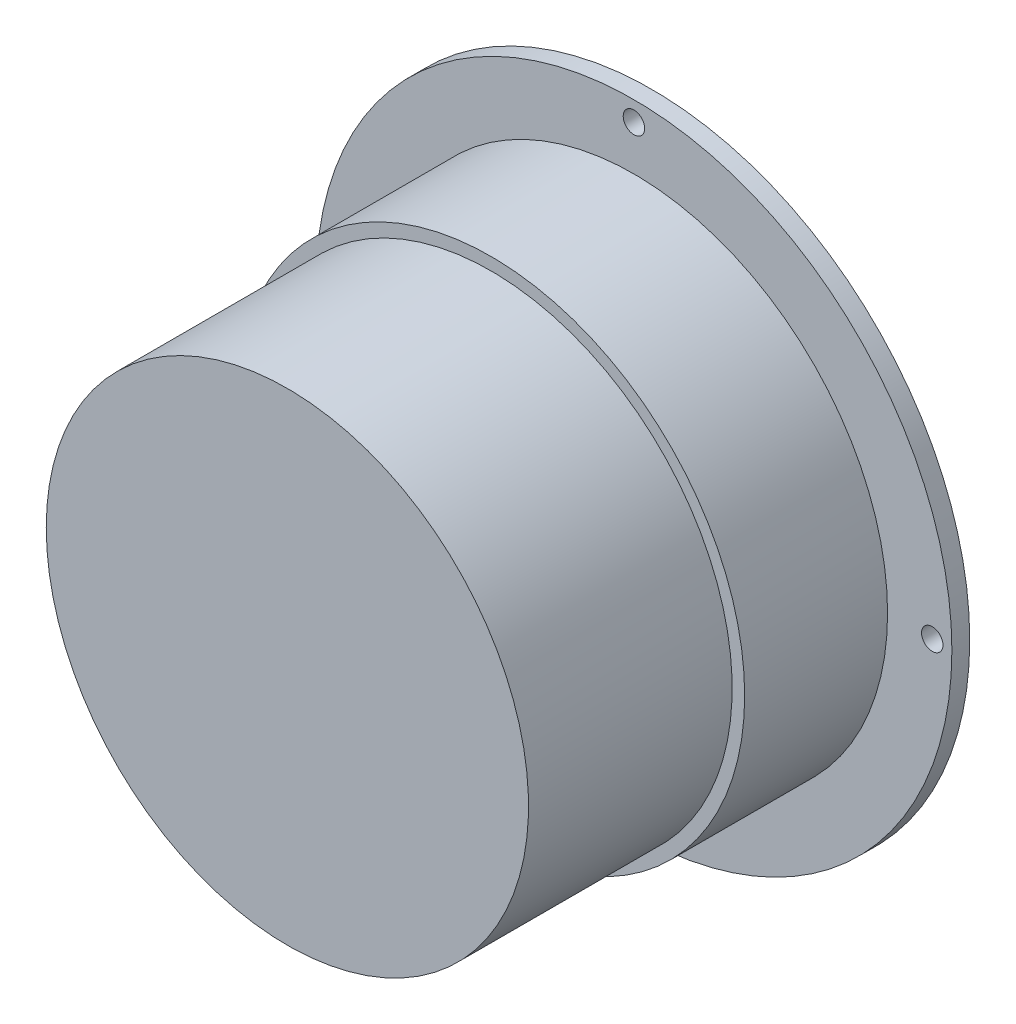
ISO-10303-21;
HEADER;
FILE_DESCRIPTION(('STEP AP214'),'2;1');
FILE_NAME('part.step','',(''),(''),'','','');
FILE_SCHEMA(('AUTOMOTIVE_DESIGN { 1 0 10303 214 1 1 1 1 }'));
ENDSEC;
DATA;
#1=APPLICATION_CONTEXT('core data for automotive mechanical design processes');
#2=APPLICATION_PROTOCOL_DEFINITION('international standard','automotive_design',2000,#1);
#3=PRODUCT_CONTEXT('',#1,'mechanical');
#4=PRODUCT('Part','Part','',(#3));
#5=PRODUCT_RELATED_PRODUCT_CATEGORY('part','',(#4));
#6=PRODUCT_DEFINITION_FORMATION('','',#4);
#7=PRODUCT_DEFINITION_CONTEXT('part definition',#1,'design');
#8=PRODUCT_DEFINITION('design','',#6,#7);
#9=PRODUCT_DEFINITION_SHAPE('','',#8);
#10=(LENGTH_UNIT() NAMED_UNIT(*) SI_UNIT(.MILLI.,.METRE.));
#11=(NAMED_UNIT(*) PLANE_ANGLE_UNIT() SI_UNIT($,.RADIAN.));
#12=(NAMED_UNIT(*) SI_UNIT($,.STERADIAN.) SOLID_ANGLE_UNIT());
#13=UNCERTAINTY_MEASURE_WITH_UNIT(LENGTH_MEASURE(1.E-05),#10,'distance_accuracy_value','');
#14=(GEOMETRIC_REPRESENTATION_CONTEXT(3) GLOBAL_UNCERTAINTY_ASSIGNED_CONTEXT((#13)) GLOBAL_UNIT_ASSIGNED_CONTEXT((#10,
#11,#12)) REPRESENTATION_CONTEXT('',''));
#15=CARTESIAN_POINT('',(0.,0.,0.));
#16=DIRECTION('',(0.,0.,1.));
#17=DIRECTION('',(1.,0.,0.));
#18=AXIS2_PLACEMENT_3D('',#15,#16,#17);
#19=CARTESIAN_POINT('',(0.,0.,2.5));
#20=DIRECTION('',(0.,0.,-1.));
#21=DIRECTION('',(-1.,0.,0.));
#22=AXIS2_PLACEMENT_3D('',#19,#20,#21);
#23=CYLINDRICAL_SURFACE('',#22,44.5);
#24=CARTESIAN_POINT('',(0.,0.,2.5));
#25=DIRECTION('',(0.,0.,1.));
#26=DIRECTION('',(1.,0.,0.));
#27=AXIS2_PLACEMENT_3D('',#24,#25,#26);
#28=CIRCLE('',#27,44.5);
#29=CARTESIAN_POINT('',(44.5,0.,2.5));
#30=VERTEX_POINT('',#29);
#31=EDGE_CURVE('E12',#30,#30,#28,.T.);
#32=ORIENTED_EDGE('',*,*,#31,.F.);
#33=EDGE_LOOP('',(#32));
#34=FACE_BOUND('',#33,.T.);
#35=CARTESIAN_POINT('',(0.,0.,0.));
#36=DIRECTION('',(0.,0.,1.));
#37=DIRECTION('',(1.,0.,0.));
#38=AXIS2_PLACEMENT_3D('',#35,#36,#37);
#39=CIRCLE('',#38,44.5);
#40=CARTESIAN_POINT('',(44.5,0.,0.));
#41=VERTEX_POINT('',#40);
#42=EDGE_CURVE('E45',#41,#41,#39,.T.);
#43=ORIENTED_EDGE('',*,*,#42,.T.);
#44=EDGE_LOOP('',(#43));
#45=FACE_BOUND('',#44,.T.);
#46=ADVANCED_FACE('F42',(#34,#45),#23,.T.);
#47=CARTESIAN_POINT('',(0.,0.,2.5));
#48=DIRECTION('',(0.,0.,1.));
#49=DIRECTION('',(1.,0.,0.));
#50=AXIS2_PLACEMENT_3D('',#47,#48,#49);
#51=PLANE('',#50);
#52=CARTESIAN_POINT('',(0.,0.,2.5));
#53=DIRECTION('',(0.,0.,1.));
#54=DIRECTION('',(1.,0.,0.));
#55=AXIS2_PLACEMENT_3D('',#52,#53,#54);
#56=CIRCLE('',#55,35.5);
#57=CARTESIAN_POINT('',(35.5,0.,2.5));
#58=VERTEX_POINT('',#57);
#59=EDGE_CURVE('E78',#58,#58,#56,.T.);
#60=ORIENTED_EDGE('',*,*,#59,.F.);
#61=EDGE_LOOP('',(#60));
#62=FACE_BOUND('',#61,.T.);
#63=CARTESIAN_POINT('',(41.7500000000012,1.18149346833293E-12,2.5));
#64=DIRECTION('',(0.,0.,1.));
#65=DIRECTION('',(1.,0.,0.));
#66=AXIS2_PLACEMENT_3D('',#63,#64,#65);
#67=CIRCLE('',#66,1.50000000000092);
#68=CARTESIAN_POINT('',(43.2500000000021,1.18149346833293E-12,2.5));
#69=VERTEX_POINT('',#68);
#70=EDGE_CURVE('E73',#69,#69,#67,.T.);
#71=ORIENTED_EDGE('',*,*,#70,.F.);
#72=EDGE_LOOP('',(#71));
#73=FACE_BOUND('',#72,.T.);
#74=CARTESIAN_POINT('',(2.36298693666585E-12,-41.75,2.5));
#75=DIRECTION('',(0.,0.,1.));
#76=DIRECTION('',(1.,0.,0.));
#77=AXIS2_PLACEMENT_3D('',#74,#75,#76);
#78=CIRCLE('',#77,1.50000000000254);
#79=CARTESIAN_POINT('',(1.5000000000049,-41.75,2.5));
#80=VERTEX_POINT('',#79);
#81=EDGE_CURVE('E67',#80,#80,#78,.T.);
#82=ORIENTED_EDGE('',*,*,#81,.F.);
#83=EDGE_LOOP('',(#82));
#84=FACE_BOUND('',#83,.T.);
#85=CARTESIAN_POINT('',(-41.7499999999988,-1.18660636871937E-12,2.5));
#86=DIRECTION('',(0.,0.,1.));
#87=DIRECTION('',(1.,0.,0.));
#88=AXIS2_PLACEMENT_3D('',#85,#86,#87);
#89=CIRCLE('',#88,1.5000000000019);
#90=CARTESIAN_POINT('',(-40.2499999999969,-1.18660636871937E-12,2.5));
#91=VERTEX_POINT('',#90);
#92=EDGE_CURVE('E60',#91,#91,#89,.T.);
#93=ORIENTED_EDGE('',*,*,#92,.F.);
#94=EDGE_LOOP('',(#93));
#95=FACE_BOUND('',#94,.T.);
#96=CARTESIAN_POINT('',(0.,41.75,2.5));
#97=DIRECTION('',(0.,0.,1.));
#98=DIRECTION('',(1.,0.,0.));
#99=AXIS2_PLACEMENT_3D('',#96,#97,#98);
#100=CIRCLE('',#99,1.5);
#101=CARTESIAN_POINT('',(1.5,41.75,2.5));
#102=VERTEX_POINT('',#101);
#103=EDGE_CURVE('E54',#102,#102,#100,.T.);
#104=ORIENTED_EDGE('',*,*,#103,.F.);
#105=EDGE_LOOP('',(#104));
#106=FACE_BOUND('',#105,.T.);
#107=ORIENTED_EDGE('',*,*,#31,.T.);
#108=EDGE_LOOP('',(#107));
#109=FACE_BOUND('',#108,.T.);
#110=ADVANCED_FACE('F111',(#62,#73,#84,#95,#106,#109),#51,.T.);
#111=CARTESIAN_POINT('',(0.,0.,0.));
#112=DIRECTION('',(0.,0.,1.));
#113=DIRECTION('',(1.,0.,0.));
#114=AXIS2_PLACEMENT_3D('',#111,#112,#113);
#115=PLANE('',#114);
#116=CARTESIAN_POINT('',(41.7500000000012,1.18149346833293E-12,0.));
#117=DIRECTION('',(0.,0.,1.));
#118=DIRECTION('',(1.,0.,0.));
#119=AXIS2_PLACEMENT_3D('',#116,#117,#118);
#120=CIRCLE('',#119,1.50000000000092);
#121=CARTESIAN_POINT('',(43.2500000000021,1.18149346833293E-12,0.));
#122=VERTEX_POINT('',#121);
#123=EDGE_CURVE('E57',#122,#122,#120,.T.);
#124=ORIENTED_EDGE('',*,*,#123,.T.);
#125=EDGE_LOOP('',(#124));
#126=FACE_BOUND('',#125,.T.);
#127=CARTESIAN_POINT('',(2.36298693666585E-12,-41.75,0.));
#128=DIRECTION('',(0.,0.,1.));
#129=DIRECTION('',(1.,0.,0.));
#130=AXIS2_PLACEMENT_3D('',#127,#128,#129);
#131=CIRCLE('',#130,1.50000000000254);
#132=CARTESIAN_POINT('',(1.5000000000049,-41.75,0.));
#133=VERTEX_POINT('',#132);
#134=EDGE_CURVE('E70',#133,#133,#131,.T.);
#135=ORIENTED_EDGE('',*,*,#134,.T.);
#136=EDGE_LOOP('',(#135));
#137=FACE_BOUND('',#136,.T.);
#138=CARTESIAN_POINT('',(-41.7499999999988,-1.18660636871937E-12,0.));
#139=DIRECTION('',(0.,0.,1.));
#140=DIRECTION('',(1.,0.,0.));
#141=AXIS2_PLACEMENT_3D('',#138,#139,#140);
#142=CIRCLE('',#141,1.5000000000019);
#143=CARTESIAN_POINT('',(-40.2499999999969,-1.18660636871937E-12,0.));
#144=VERTEX_POINT('',#143);
#145=EDGE_CURVE('E63',#144,#144,#142,.T.);
#146=ORIENTED_EDGE('',*,*,#145,.T.);
#147=EDGE_LOOP('',(#146));
#148=FACE_BOUND('',#147,.T.);
#149=CARTESIAN_POINT('',(0.,41.75,0.));
#150=DIRECTION('',(0.,0.,1.));
#151=DIRECTION('',(1.,0.,0.));
#152=AXIS2_PLACEMENT_3D('',#149,#150,#151);
#153=CIRCLE('',#152,1.5);
#154=CARTESIAN_POINT('',(1.5,41.75,0.));
#155=VERTEX_POINT('',#154);
#156=EDGE_CURVE('E52',#155,#155,#153,.T.);
#157=ORIENTED_EDGE('',*,*,#156,.T.);
#158=EDGE_LOOP('',(#157));
#159=FACE_BOUND('',#158,.T.);
#160=ORIENTED_EDGE('',*,*,#42,.F.);
#161=EDGE_LOOP('',(#160));
#162=FACE_BOUND('',#161,.T.);
#163=ADVANCED_FACE('F114',(#126,#137,#148,#159,#162),#115,.F.);
#164=CARTESIAN_POINT('',(0.,41.75,0.));
#165=DIRECTION('',(0.,0.,1.));
#166=DIRECTION('',(1.,0.,0.));
#167=AXIS2_PLACEMENT_3D('',#164,#165,#166);
#168=CYLINDRICAL_SURFACE('',#167,1.5);
#169=ORIENTED_EDGE('',*,*,#156,.F.);
#170=EDGE_LOOP('',(#169));
#171=FACE_BOUND('',#170,.T.);
#172=ORIENTED_EDGE('',*,*,#103,.T.);
#173=EDGE_LOOP('',(#172));
#174=FACE_BOUND('',#173,.T.);
#175=ADVANCED_FACE('F124',(#171,#174),#168,.F.);
#176=CARTESIAN_POINT('',(-41.7499999999988,-1.18660636871937E-12,0.));
#177=DIRECTION('',(0.,0.,1.));
#178=DIRECTION('',(1.,0.,0.));
#179=AXIS2_PLACEMENT_3D('',#176,#177,#178);
#180=CYLINDRICAL_SURFACE('',#179,1.5000000000019);
#181=ORIENTED_EDGE('',*,*,#145,.F.);
#182=EDGE_LOOP('',(#181));
#183=FACE_BOUND('',#182,.T.);
#184=ORIENTED_EDGE('',*,*,#92,.T.);
#185=EDGE_LOOP('',(#184));
#186=FACE_BOUND('',#185,.T.);
#187=ADVANCED_FACE('F126',(#183,#186),#180,.F.);
#188=CARTESIAN_POINT('',(2.36298693666585E-12,-41.75,0.));
#189=DIRECTION('',(0.,0.,1.));
#190=DIRECTION('',(1.,0.,0.));
#191=AXIS2_PLACEMENT_3D('',#188,#189,#190);
#192=CYLINDRICAL_SURFACE('',#191,1.50000000000254);
#193=ORIENTED_EDGE('',*,*,#134,.F.);
#194=EDGE_LOOP('',(#193));
#195=FACE_BOUND('',#194,.T.);
#196=ORIENTED_EDGE('',*,*,#81,.T.);
#197=EDGE_LOOP('',(#196));
#198=FACE_BOUND('',#197,.T.);
#199=ADVANCED_FACE('F133',(#195,#198),#192,.F.);
#200=CARTESIAN_POINT('',(41.7500000000012,1.18149346833293E-12,0.));
#201=DIRECTION('',(0.,0.,1.));
#202=DIRECTION('',(1.,0.,0.));
#203=AXIS2_PLACEMENT_3D('',#200,#201,#202);
#204=CYLINDRICAL_SURFACE('',#203,1.50000000000092);
#205=ORIENTED_EDGE('',*,*,#123,.F.);
#206=EDGE_LOOP('',(#205));
#207=FACE_BOUND('',#206,.T.);
#208=ORIENTED_EDGE('',*,*,#70,.T.);
#209=EDGE_LOOP('',(#208));
#210=FACE_BOUND('',#209,.T.);
#211=ADVANCED_FACE('F107',(#207,#210),#204,.F.);
#212=CARTESIAN_POINT('',(0.,0.,22.5));
#213=DIRECTION('',(0.,0.,-1.));
#214=DIRECTION('',(-1.,0.,0.));
#215=AXIS2_PLACEMENT_3D('',#212,#213,#214);
#216=CYLINDRICAL_SURFACE('',#215,35.5);
#217=CARTESIAN_POINT('',(0.,0.,22.5));
#218=DIRECTION('',(0.,0.,1.));
#219=DIRECTION('',(1.,0.,0.));
#220=AXIS2_PLACEMENT_3D('',#217,#218,#219);
#221=CIRCLE('',#220,35.5);
#222=CARTESIAN_POINT('',(35.5,0.,22.5));
#223=VERTEX_POINT('',#222);
#224=EDGE_CURVE('E64',#223,#223,#221,.T.);
#225=ORIENTED_EDGE('',*,*,#224,.F.);
#226=EDGE_LOOP('',(#225));
#227=FACE_BOUND('',#226,.T.);
#228=ORIENTED_EDGE('',*,*,#59,.T.);
#229=EDGE_LOOP('',(#228));
#230=FACE_BOUND('',#229,.T.);
#231=ADVANCED_FACE('F101',(#227,#230),#216,.T.);
#232=CARTESIAN_POINT('',(0.,0.,22.5));
#233=DIRECTION('',(0.,0.,1.));
#234=DIRECTION('',(1.,0.,0.));
#235=AXIS2_PLACEMENT_3D('',#232,#233,#234);
#236=PLANE('',#235);
#237=CARTESIAN_POINT('',(0.,0.,22.5));
#238=DIRECTION('',(0.,0.,1.));
#239=DIRECTION('',(1.,0.,0.));
#240=AXIS2_PLACEMENT_3D('',#237,#238,#239);
#241=CIRCLE('',#240,33.75);
#242=CARTESIAN_POINT('',(-33.75,0.,22.5));
#243=VERTEX_POINT('',#242);
#244=EDGE_CURVE('E84',#243,#243,#241,.T.);
#245=ORIENTED_EDGE('',*,*,#244,.F.);
#246=EDGE_LOOP('',(#245));
#247=FACE_BOUND('',#246,.T.);
#248=ORIENTED_EDGE('',*,*,#224,.T.);
#249=EDGE_LOOP('',(#248));
#250=FACE_BOUND('',#249,.T.);
#251=ADVANCED_FACE('F95',(#247,#250),#236,.T.);
#252=CARTESIAN_POINT('',(0.,0.,51.));
#253=DIRECTION('',(0.,0.,-1.));
#254=DIRECTION('',(-1.,0.,0.));
#255=AXIS2_PLACEMENT_3D('',#252,#253,#254);
#256=CYLINDRICAL_SURFACE('',#255,33.75);
#257=CARTESIAN_POINT('',(0.,0.,51.));
#258=DIRECTION('',(0.,0.,1.));
#259=DIRECTION('',(1.,0.,0.));
#260=AXIS2_PLACEMENT_3D('',#257,#258,#259);
#261=CIRCLE('',#260,33.75);
#262=CARTESIAN_POINT('',(-33.75,0.,51.));
#263=VERTEX_POINT('',#262);
#264=EDGE_CURVE('E81',#263,#263,#261,.T.);
#265=CARTESIAN_POINT('',(-33.75,0.,51.));
#266=CARTESIAN_POINT('',(-33.75,0.,50.703125));
#267=CARTESIAN_POINT('',(-33.75,0.,50.40625));
#268=CARTESIAN_POINT('',(-33.75,0.,49.8125));
#269=CARTESIAN_POINT('',(-33.75,0.,49.515625));
#270=CARTESIAN_POINT('',(-33.75,0.,48.921875));
#271=CARTESIAN_POINT('',(-33.75,0.,48.625));
#272=CARTESIAN_POINT('',(-33.75,0.,48.03125));
#273=CARTESIAN_POINT('',(-33.75,0.,47.734375));
#274=CARTESIAN_POINT('',(-33.75,0.,47.140625));
#275=CARTESIAN_POINT('',(-33.75,0.,46.84375));
#276=CARTESIAN_POINT('',(-33.75,0.,46.25));
#277=CARTESIAN_POINT('',(-33.75,0.,45.953125));
#278=CARTESIAN_POINT('',(-33.75,0.,45.359375));
#279=CARTESIAN_POINT('',(-33.75,0.,45.0625));
#280=CARTESIAN_POINT('',(-33.75,0.,44.46875));
#281=CARTESIAN_POINT('',(-33.75,0.,44.171875));
#282=CARTESIAN_POINT('',(-33.75,0.,43.578125));
#283=CARTESIAN_POINT('',(-33.75,0.,43.28125));
#284=CARTESIAN_POINT('',(-33.75,0.,42.6875));
#285=CARTESIAN_POINT('',(-33.75,0.,42.390625));
#286=CARTESIAN_POINT('',(-33.75,0.,41.796875));
#287=CARTESIAN_POINT('',(-33.75,0.,41.5));
#288=CARTESIAN_POINT('',(-33.75,0.,40.90625));
#289=CARTESIAN_POINT('',(-33.75,0.,40.609375));
#290=CARTESIAN_POINT('',(-33.75,0.,40.015625));
#291=CARTESIAN_POINT('',(-33.75,0.,39.71875));
#292=CARTESIAN_POINT('',(-33.75,0.,39.125));
#293=CARTESIAN_POINT('',(-33.75,0.,38.828125));
#294=CARTESIAN_POINT('',(-33.75,0.,38.234375));
#295=CARTESIAN_POINT('',(-33.75,0.,37.9375));
#296=CARTESIAN_POINT('',(-33.75,0.,37.34375));
#297=CARTESIAN_POINT('',(-33.75,0.,37.046875));
#298=CARTESIAN_POINT('',(-33.75,0.,36.453125));
#299=CARTESIAN_POINT('',(-33.75,0.,36.15625));
#300=CARTESIAN_POINT('',(-33.75,0.,35.5625));
#301=CARTESIAN_POINT('',(-33.75,0.,35.265625));
#302=CARTESIAN_POINT('',(-33.75,0.,34.671875));
#303=CARTESIAN_POINT('',(-33.75,0.,34.375));
#304=CARTESIAN_POINT('',(-33.75,0.,33.78125));
#305=CARTESIAN_POINT('',(-33.75,0.,33.484375));
#306=CARTESIAN_POINT('',(-33.75,0.,32.890625));
#307=CARTESIAN_POINT('',(-33.75,0.,32.59375));
#308=CARTESIAN_POINT('',(-33.75,0.,32.));
#309=CARTESIAN_POINT('',(-33.75,0.,31.703125));
#310=CARTESIAN_POINT('',(-33.75,0.,31.109375));
#311=CARTESIAN_POINT('',(-33.75,0.,30.8125));
#312=CARTESIAN_POINT('',(-33.75,0.,30.21875));
#313=CARTESIAN_POINT('',(-33.75,0.,29.921875));
#314=CARTESIAN_POINT('',(-33.75,0.,29.328125));
#315=CARTESIAN_POINT('',(-33.75,0.,29.03125));
#316=CARTESIAN_POINT('',(-33.75,0.,28.4375));
#317=CARTESIAN_POINT('',(-33.75,0.,28.140625));
#318=CARTESIAN_POINT('',(-33.75,0.,27.546875));
#319=CARTESIAN_POINT('',(-33.75,0.,27.25));
#320=CARTESIAN_POINT('',(-33.75,0.,26.65625));
#321=CARTESIAN_POINT('',(-33.75,0.,26.359375));
#322=CARTESIAN_POINT('',(-33.75,0.,25.765625));
#323=CARTESIAN_POINT('',(-33.75,0.,25.46875));
#324=CARTESIAN_POINT('',(-33.75,0.,24.875));
#325=CARTESIAN_POINT('',(-33.75,0.,24.578125));
#326=CARTESIAN_POINT('',(-33.75,0.,23.984375));
#327=CARTESIAN_POINT('',(-33.75,0.,23.6875));
#328=CARTESIAN_POINT('',(-33.75,0.,23.09375));
#329=CARTESIAN_POINT('',(-33.75,0.,22.796875));
#330=CARTESIAN_POINT('',(-33.75,0.,22.5));
#331=B_SPLINE_CURVE_WITH_KNOTS('',3,(#265,#266,#267,#268,#269,#270,#271,#272,#273,#274,#275,
#276,#277,#278,#279,#280,#281,#282,#283,#284,#285,#286,#287,#288,#289,#290,#291,#292,#293,#294,
#295,#296,#297,#298,#299,#300,#301,#302,#303,#304,#305,#306,#307,#308,#309,#310,#311,#312,#313,
#314,#315,#316,#317,#318,#319,#320,#321,#322,#323,#324,#325,#326,#327,#328,#329,#330),
.UNSPECIFIED.,.F.,.F.,(4,2,2,2,2,2,2,2,2,2,2,2,2,2,2,2,2,2,2,2,2,2,2,2,2,2,2,2,2,2,2,2,4),(0.,
0.890625000000006,1.78125000000001,2.671875,3.5625,4.453125,5.34375,6.23437500000001,
7.12500000000001,8.01562500000001,8.90625,9.796875,10.6875,11.578125,12.46875,13.359375,14.25,
15.140625,16.03125,16.921875,17.8125,18.703125,19.59375,20.484375,21.375,22.265625,23.15625,
24.046875,24.9375,25.828125,26.71875,27.609375,28.5),.UNSPECIFIED.);
#332=EDGE_CURVE('BSEAM92',#263,#243,#331,.T.);
#333=ORIENTED_EDGE('',*,*,#264,.F.);
#334=ORIENTED_EDGE('',*,*,#244,.T.);
#335=ORIENTED_EDGE('',*,*,#332,.T.);
#336=ORIENTED_EDGE('',*,*,#332,.F.);
#337=EDGE_LOOP('',(#333,#335,#334,#336));
#338=FACE_BOUND('',#337,.T.);
#339=ADVANCED_FACE('F92',(#338),#256,.T.);
#340=CARTESIAN_POINT('',(0.,0.,51.));
#341=DIRECTION('',(0.,0.,1.));
#342=DIRECTION('',(1.,0.,0.));
#343=AXIS2_PLACEMENT_3D('',#340,#341,#342);
#344=PLANE('',#343);
#345=ORIENTED_EDGE('',*,*,#264,.T.);
#346=EDGE_LOOP('',(#345));
#347=FACE_BOUND('',#346,.T.);
#348=ADVANCED_FACE('F90',(#347),#344,.T.);
#349=CLOSED_SHELL('',(#46,#110,#163,#175,#187,#199,#211,#231,#251,#339,#348));
#350=MANIFOLD_SOLID_BREP('B2',#349);
#351=ADVANCED_BREP_SHAPE_REPRESENTATION('',(#18,#350),#14);
#352=SHAPE_DEFINITION_REPRESENTATION(#9,#351);
ENDSEC;
END-ISO-10303-21;
